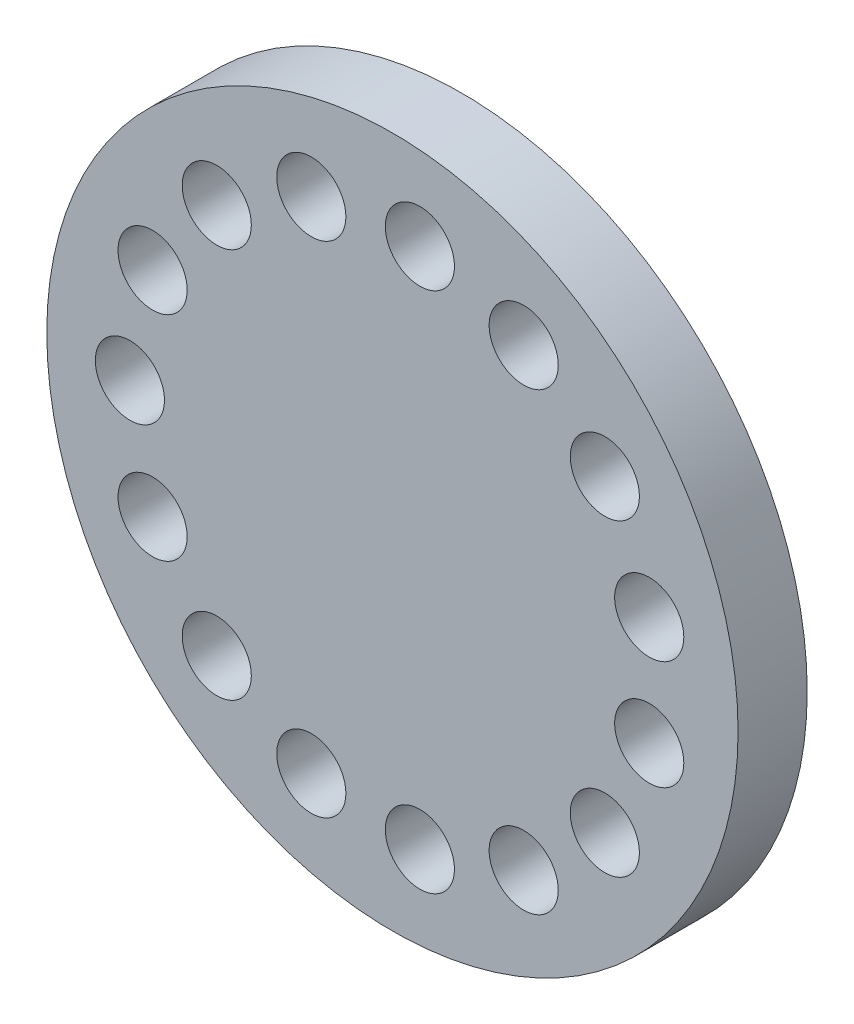
ISO-10303-21;
HEADER;
FILE_DESCRIPTION(('STEP AP214'),'2;1');
FILE_NAME('part.step','',(''),(''),'','','');
FILE_SCHEMA(('AUTOMOTIVE_DESIGN { 1 0 10303 214 1 1 1 1 }'));
ENDSEC;
DATA;
#1=APPLICATION_CONTEXT('core data for automotive mechanical design processes');
#2=APPLICATION_PROTOCOL_DEFINITION('international standard','automotive_design',2000,#1);
#3=PRODUCT_CONTEXT('',#1,'mechanical');
#4=PRODUCT('Part','Part','',(#3));
#5=PRODUCT_RELATED_PRODUCT_CATEGORY('part','',(#4));
#6=PRODUCT_DEFINITION_FORMATION('','',#4);
#7=PRODUCT_DEFINITION_CONTEXT('part definition',#1,'design');
#8=PRODUCT_DEFINITION('design','',#6,#7);
#9=PRODUCT_DEFINITION_SHAPE('','',#8);
#10=(LENGTH_UNIT() NAMED_UNIT(*) SI_UNIT(.MILLI.,.METRE.));
#11=(NAMED_UNIT(*) PLANE_ANGLE_UNIT() SI_UNIT($,.RADIAN.));
#12=(NAMED_UNIT(*) SI_UNIT($,.STERADIAN.) SOLID_ANGLE_UNIT());
#13=UNCERTAINTY_MEASURE_WITH_UNIT(LENGTH_MEASURE(1.E-05),#10,'distance_accuracy_value','');
#14=(GEOMETRIC_REPRESENTATION_CONTEXT(3) GLOBAL_UNCERTAINTY_ASSIGNED_CONTEXT((#13)) GLOBAL_UNIT_ASSIGNED_CONTEXT((#10,
#11,#12)) REPRESENTATION_CONTEXT('',''));
#15=CARTESIAN_POINT('',(0.,0.,0.));
#16=DIRECTION('',(0.,0.,1.));
#17=DIRECTION('',(1.,0.,0.));
#18=AXIS2_PLACEMENT_3D('',#15,#16,#17);
#19=CARTESIAN_POINT('',(0.,0.,10.));
#20=DIRECTION('',(0.,0.,1.));
#21=DIRECTION('',(1.,0.,0.));
#22=AXIS2_PLACEMENT_3D('',#19,#20,#21);
#23=PLANE('',#22);
#24=CARTESIAN_POINT('',(-25.4116394399646,-28.2224847843511,10.));
#25=DIRECTION('',(0.,0.,1.));
#26=DIRECTION('',(1.,0.,0.));
#27=AXIS2_PLACEMENT_3D('',#24,#25,#26);
#28=CIRCLE('',#27,5.);
#29=CARTESIAN_POINT('',(-20.4116394399646,-28.2224847843511,10.));
#30=VERTEX_POINT('',#29);
#31=EDGE_CURVE('E118',#30,#30,#28,.T.);
#32=ORIENTED_EDGE('',*,*,#31,.F.);
#33=EDGE_LOOP('',(#32));
#34=FACE_BOUND('',#33,.T.);
#35=CARTESIAN_POINT('',(3.9696878225689,-37.7690567134135,10.));
#36=DIRECTION('',(0.,0.,1.));
#37=DIRECTION('',(1.,0.,0.));
#38=AXIS2_PLACEMENT_3D('',#35,#36,#37);
#39=CIRCLE('',#38,5.);
#40=CARTESIAN_POINT('',(8.96968782256891,-37.7690567134135,10.));
#41=VERTEX_POINT('',#40);
#42=EDGE_CURVE('E106',#41,#41,#39,.T.);
#43=ORIENTED_EDGE('',*,*,#42,.F.);
#44=EDGE_LOOP('',(#43));
#45=FACE_BOUND('',#44,.T.);
#46=CARTESIAN_POINT('',(30.7241186795064,-22.3223788561457,10.));
#47=DIRECTION('',(0.,0.,1.));
#48=DIRECTION('',(1.,0.,0.));
#49=AXIS2_PLACEMENT_3D('',#46,#47,#48);
#50=CIRCLE('',#49,5.);
#51=CARTESIAN_POINT('',(35.7241186795064,-22.3223788561457,10.));
#52=VERTEX_POINT('',#51);
#53=EDGE_CURVE('E94',#52,#52,#50,.T.);
#54=ORIENTED_EDGE('',*,*,#53,.F.);
#55=EDGE_LOOP('',(#54));
#56=FACE_BOUND('',#55,.T.);
#57=CARTESIAN_POINT('',(37.1472085011503,7.89588291464368,10.));
#58=DIRECTION('',(0.,0.,1.));
#59=DIRECTION('',(1.,0.,0.));
#60=AXIS2_PLACEMENT_3D('',#57,#58,#59);
#61=CIRCLE('',#60,5.);
#62=CARTESIAN_POINT('',(42.1472085011503,7.89588291464368,10.));
#63=VERTEX_POINT('',#62);
#64=EDGE_CURVE('E82',#63,#63,#61,.T.);
#65=ORIENTED_EDGE('',*,*,#64,.F.);
#66=EDGE_LOOP('',(#65));
#67=FACE_BOUND('',#66,.T.);
#68=CARTESIAN_POINT('',(18.9885496183208,32.8891327009738,10.));
#69=DIRECTION('',(0.,0.,1.));
#70=DIRECTION('',(1.,0.,0.));
#71=AXIS2_PLACEMENT_3D('',#68,#69,#70);
#72=CIRCLE('',#71,5.);
#73=CARTESIAN_POINT('',(23.9885496183208,32.8891327009738,10.));
#74=VERTEX_POINT('',#73);
#75=EDGE_CURVE('E70',#74,#74,#72,.T.);
#76=ORIENTED_EDGE('',*,*,#75,.F.);
#77=EDGE_LOOP('',(#76));
#78=FACE_BOUND('',#77,.T.);
#79=CARTESIAN_POINT('',(-11.7355690611859,36.1183676989954,10.));
#80=DIRECTION('',(0.,0.,1.));
#81=DIRECTION('',(1.,0.,0.));
#82=AXIS2_PLACEMENT_3D('',#79,#80,#81);
#83=CIRCLE('',#82,4.99999999999999);
#84=CARTESIAN_POINT('',(-6.7355690611859,36.1183676989954,10.));
#85=VERTEX_POINT('',#84);
#86=EDGE_CURVE('E58',#85,#85,#83,.T.);
#87=ORIENTED_EDGE('',*,*,#86,.F.);
#88=EDGE_LOOP('',(#87));
#89=FACE_BOUND('',#88,.T.);
#90=CARTESIAN_POINT('',(-34.6938065020759,15.446677857268,10.));
#91=DIRECTION('',(0.,0.,1.));
#92=DIRECTION('',(1.,0.,0.));
#93=AXIS2_PLACEMENT_3D('',#90,#91,#92);
#94=CIRCLE('',#93,5.);
#95=CARTESIAN_POINT('',(-29.6938065020759,15.446677857268,10.));
#96=VERTEX_POINT('',#95);
#97=EDGE_CURVE('E46',#96,#96,#94,.T.);
#98=ORIENTED_EDGE('',*,*,#97,.F.);
#99=EDGE_LOOP('',(#98));
#100=FACE_BOUND('',#99,.T.);
#101=CARTESIAN_POINT('',(0.,0.,10.));
#102=DIRECTION('',(0.,0.,1.));
#103=DIRECTION('',(1.,0.,0.));
#104=AXIS2_PLACEMENT_3D('',#101,#102,#103);
#105=CIRCLE('',#104,50.);
#106=CARTESIAN_POINT('',(50.,0.,10.));
#107=VERTEX_POINT('',#106);
#108=EDGE_CURVE('E10',#107,#107,#105,.T.);
#109=ORIENTED_EDGE('',*,*,#108,.T.);
#110=EDGE_LOOP('',(#109));
#111=FACE_BOUND('',#110,.T.);
#112=CARTESIAN_POINT('',(-37.9770992366412,0.,10.));
#113=DIRECTION('',(0.,0.,1.));
#114=DIRECTION('',(1.,0.,0.));
#115=AXIS2_PLACEMENT_3D('',#112,#113,#114);
#116=CIRCLE('',#115,5.);
#117=CARTESIAN_POINT('',(-32.9770992366412,0.,10.));
#118=VERTEX_POINT('',#117);
#119=EDGE_CURVE('E41',#118,#118,#116,.T.);
#120=ORIENTED_EDGE('',*,*,#119,.F.);
#121=EDGE_LOOP('',(#120));
#122=FACE_BOUND('',#121,.T.);
#123=CARTESIAN_POINT('',(-25.4116394399642,28.2224847843515,10.));
#124=DIRECTION('',(0.,0.,1.));
#125=DIRECTION('',(1.,0.,0.));
#126=AXIS2_PLACEMENT_3D('',#123,#124,#125);
#127=CIRCLE('',#126,5.);
#128=CARTESIAN_POINT('',(-20.4116394399642,28.2224847843515,10.));
#129=VERTEX_POINT('',#128);
#130=EDGE_CURVE('E52',#129,#129,#127,.T.);
#131=ORIENTED_EDGE('',*,*,#130,.F.);
#132=EDGE_LOOP('',(#131));
#133=FACE_BOUND('',#132,.T.);
#134=CARTESIAN_POINT('',(3.96968782256942,37.7690567134134,10.));
#135=DIRECTION('',(0.,0.,1.));
#136=DIRECTION('',(1.,0.,0.));
#137=AXIS2_PLACEMENT_3D('',#134,#135,#136);
#138=CIRCLE('',#137,5.);
#139=CARTESIAN_POINT('',(8.96968782256942,37.7690567134134,10.));
#140=VERTEX_POINT('',#139);
#141=EDGE_CURVE('E64',#140,#140,#138,.T.);
#142=ORIENTED_EDGE('',*,*,#141,.F.);
#143=EDGE_LOOP('',(#142));
#144=FACE_BOUND('',#143,.T.);
#145=CARTESIAN_POINT('',(30.7241186795067,22.3223788561453,10.));
#146=DIRECTION('',(0.,0.,1.));
#147=DIRECTION('',(1.,0.,0.));
#148=AXIS2_PLACEMENT_3D('',#145,#146,#147);
#149=CIRCLE('',#148,5.);
#150=CARTESIAN_POINT('',(35.7241186795067,22.3223788561453,10.));
#151=VERTEX_POINT('',#150);
#152=EDGE_CURVE('E76',#151,#151,#149,.T.);
#153=ORIENTED_EDGE('',*,*,#152,.F.);
#154=EDGE_LOOP('',(#153));
#155=FACE_BOUND('',#154,.T.);
#156=CARTESIAN_POINT('',(37.1472085011502,-7.89588291464418,10.));
#157=DIRECTION('',(0.,0.,1.));
#158=DIRECTION('',(1.,0.,0.));
#159=AXIS2_PLACEMENT_3D('',#156,#157,#158);
#160=CIRCLE('',#159,4.99999999999999);
#161=CARTESIAN_POINT('',(42.1472085011502,-7.89588291464418,10.));
#162=VERTEX_POINT('',#161);
#163=EDGE_CURVE('E88',#162,#162,#160,.T.);
#164=ORIENTED_EDGE('',*,*,#163,.F.);
#165=EDGE_LOOP('',(#164));
#166=FACE_BOUND('',#165,.T.);
#167=CARTESIAN_POINT('',(18.9885496183203,-32.8891327009741,10.));
#168=DIRECTION('',(0.,0.,1.));
#169=DIRECTION('',(1.,0.,0.));
#170=AXIS2_PLACEMENT_3D('',#167,#168,#169);
#171=CIRCLE('',#170,5.);
#172=CARTESIAN_POINT('',(23.9885496183203,-32.8891327009741,10.));
#173=VERTEX_POINT('',#172);
#174=EDGE_CURVE('E100',#173,#173,#171,.T.);
#175=ORIENTED_EDGE('',*,*,#174,.F.);
#176=EDGE_LOOP('',(#175));
#177=FACE_BOUND('',#176,.T.);
#178=CARTESIAN_POINT('',(-11.7355690611864,-36.1183676989952,10.));
#179=DIRECTION('',(0.,0.,1.));
#180=DIRECTION('',(1.,0.,0.));
#181=AXIS2_PLACEMENT_3D('',#178,#179,#180);
#182=CIRCLE('',#181,5.);
#183=CARTESIAN_POINT('',(-6.73556906118636,-36.1183676989952,10.));
#184=VERTEX_POINT('',#183);
#185=EDGE_CURVE('E112',#184,#184,#182,.T.);
#186=ORIENTED_EDGE('',*,*,#185,.F.);
#187=EDGE_LOOP('',(#186));
#188=FACE_BOUND('',#187,.T.);
#189=CARTESIAN_POINT('',(-34.6938065020761,-15.4466778572676,10.));
#190=DIRECTION('',(0.,0.,1.));
#191=DIRECTION('',(1.,0.,0.));
#192=AXIS2_PLACEMENT_3D('',#189,#190,#191);
#193=CIRCLE('',#192,5.);
#194=CARTESIAN_POINT('',(-29.6938065020761,-15.4466778572676,10.));
#195=VERTEX_POINT('',#194);
#196=EDGE_CURVE('E124',#195,#195,#193,.T.);
#197=ORIENTED_EDGE('',*,*,#196,.F.);
#198=EDGE_LOOP('',(#197));
#199=FACE_BOUND('',#198,.T.);
#200=ADVANCED_FACE('F30',(#34,#45,#56,#67,#78,#89,#100,#111,#122,#133,#144,#155,#166,#177,#188,
#199),#23,.T.);
#201=CARTESIAN_POINT('',(0.,0.,0.));
#202=DIRECTION('',(0.,0.,1.));
#203=DIRECTION('',(1.,0.,0.));
#204=AXIS2_PLACEMENT_3D('',#201,#202,#203);
#205=PLANE('',#204);
#206=CARTESIAN_POINT('',(0.,0.,0.));
#207=DIRECTION('',(0.,0.,1.));
#208=DIRECTION('',(1.,0.,0.));
#209=AXIS2_PLACEMENT_3D('',#206,#207,#208);
#210=CIRCLE('',#209,50.);
#211=CARTESIAN_POINT('',(50.,0.,0.));
#212=VERTEX_POINT('',#211);
#213=EDGE_CURVE('E34',#212,#212,#210,.T.);
#214=ORIENTED_EDGE('',*,*,#213,.F.);
#215=EDGE_LOOP('',(#214));
#216=FACE_BOUND('',#215,.T.);
#217=CARTESIAN_POINT('',(-37.9770992366412,0.,0.));
#218=DIRECTION('',(0.,0.,1.));
#219=DIRECTION('',(1.,0.,0.));
#220=AXIS2_PLACEMENT_3D('',#217,#218,#219);
#221=CIRCLE('',#220,5.);
#222=CARTESIAN_POINT('',(-32.9770992366412,0.,0.));
#223=VERTEX_POINT('',#222);
#224=EDGE_CURVE('E43',#223,#223,#221,.T.);
#225=ORIENTED_EDGE('',*,*,#224,.T.);
#226=EDGE_LOOP('',(#225));
#227=FACE_BOUND('',#226,.T.);
#228=CARTESIAN_POINT('',(-34.6938065020759,15.446677857268,0.));
#229=DIRECTION('',(0.,0.,1.));
#230=DIRECTION('',(1.,0.,0.));
#231=AXIS2_PLACEMENT_3D('',#228,#229,#230);
#232=CIRCLE('',#231,5.);
#233=CARTESIAN_POINT('',(-29.6938065020759,15.446677857268,0.));
#234=VERTEX_POINT('',#233);
#235=EDGE_CURVE('E49',#234,#234,#232,.T.);
#236=ORIENTED_EDGE('',*,*,#235,.T.);
#237=EDGE_LOOP('',(#236));
#238=FACE_BOUND('',#237,.T.);
#239=CARTESIAN_POINT('',(-25.4116394399642,28.2224847843515,0.));
#240=DIRECTION('',(0.,0.,1.));
#241=DIRECTION('',(1.,0.,0.));
#242=AXIS2_PLACEMENT_3D('',#239,#240,#241);
#243=CIRCLE('',#242,5.);
#244=CARTESIAN_POINT('',(-20.4116394399642,28.2224847843515,0.));
#245=VERTEX_POINT('',#244);
#246=EDGE_CURVE('E55',#245,#245,#243,.T.);
#247=ORIENTED_EDGE('',*,*,#246,.T.);
#248=EDGE_LOOP('',(#247));
#249=FACE_BOUND('',#248,.T.);
#250=CARTESIAN_POINT('',(-11.7355690611859,36.1183676989954,0.));
#251=DIRECTION('',(0.,0.,1.));
#252=DIRECTION('',(1.,0.,0.));
#253=AXIS2_PLACEMENT_3D('',#250,#251,#252);
#254=CIRCLE('',#253,4.99999999999999);
#255=CARTESIAN_POINT('',(-6.7355690611859,36.1183676989954,0.));
#256=VERTEX_POINT('',#255);
#257=EDGE_CURVE('E61',#256,#256,#254,.T.);
#258=ORIENTED_EDGE('',*,*,#257,.T.);
#259=EDGE_LOOP('',(#258));
#260=FACE_BOUND('',#259,.T.);
#261=CARTESIAN_POINT('',(3.96968782256942,37.7690567134134,0.));
#262=DIRECTION('',(0.,0.,1.));
#263=DIRECTION('',(1.,0.,0.));
#264=AXIS2_PLACEMENT_3D('',#261,#262,#263);
#265=CIRCLE('',#264,5.);
#266=CARTESIAN_POINT('',(8.96968782256942,37.7690567134134,0.));
#267=VERTEX_POINT('',#266);
#268=EDGE_CURVE('E67',#267,#267,#265,.T.);
#269=ORIENTED_EDGE('',*,*,#268,.T.);
#270=EDGE_LOOP('',(#269));
#271=FACE_BOUND('',#270,.T.);
#272=CARTESIAN_POINT('',(18.9885496183208,32.8891327009738,0.));
#273=DIRECTION('',(0.,0.,1.));
#274=DIRECTION('',(1.,0.,0.));
#275=AXIS2_PLACEMENT_3D('',#272,#273,#274);
#276=CIRCLE('',#275,5.);
#277=CARTESIAN_POINT('',(23.9885496183208,32.8891327009738,0.));
#278=VERTEX_POINT('',#277);
#279=EDGE_CURVE('E73',#278,#278,#276,.T.);
#280=ORIENTED_EDGE('',*,*,#279,.T.);
#281=EDGE_LOOP('',(#280));
#282=FACE_BOUND('',#281,.T.);
#283=CARTESIAN_POINT('',(30.7241186795067,22.3223788561453,0.));
#284=DIRECTION('',(0.,0.,1.));
#285=DIRECTION('',(1.,0.,0.));
#286=AXIS2_PLACEMENT_3D('',#283,#284,#285);
#287=CIRCLE('',#286,5.);
#288=CARTESIAN_POINT('',(35.7241186795067,22.3223788561453,0.));
#289=VERTEX_POINT('',#288);
#290=EDGE_CURVE('E79',#289,#289,#287,.T.);
#291=ORIENTED_EDGE('',*,*,#290,.T.);
#292=EDGE_LOOP('',(#291));
#293=FACE_BOUND('',#292,.T.);
#294=CARTESIAN_POINT('',(37.1472085011503,7.89588291464368,0.));
#295=DIRECTION('',(0.,0.,1.));
#296=DIRECTION('',(1.,0.,0.));
#297=AXIS2_PLACEMENT_3D('',#294,#295,#296);
#298=CIRCLE('',#297,5.);
#299=CARTESIAN_POINT('',(42.1472085011503,7.89588291464368,0.));
#300=VERTEX_POINT('',#299);
#301=EDGE_CURVE('E85',#300,#300,#298,.T.);
#302=ORIENTED_EDGE('',*,*,#301,.T.);
#303=EDGE_LOOP('',(#302));
#304=FACE_BOUND('',#303,.T.);
#305=CARTESIAN_POINT('',(37.1472085011502,-7.89588291464418,0.));
#306=DIRECTION('',(0.,0.,1.));
#307=DIRECTION('',(1.,0.,0.));
#308=AXIS2_PLACEMENT_3D('',#305,#306,#307);
#309=CIRCLE('',#308,4.99999999999999);
#310=CARTESIAN_POINT('',(42.1472085011502,-7.89588291464418,0.));
#311=VERTEX_POINT('',#310);
#312=EDGE_CURVE('E91',#311,#311,#309,.T.);
#313=ORIENTED_EDGE('',*,*,#312,.T.);
#314=EDGE_LOOP('',(#313));
#315=FACE_BOUND('',#314,.T.);
#316=CARTESIAN_POINT('',(30.7241186795064,-22.3223788561457,0.));
#317=DIRECTION('',(0.,0.,1.));
#318=DIRECTION('',(1.,0.,0.));
#319=AXIS2_PLACEMENT_3D('',#316,#317,#318);
#320=CIRCLE('',#319,5.);
#321=CARTESIAN_POINT('',(35.7241186795064,-22.3223788561457,0.));
#322=VERTEX_POINT('',#321);
#323=EDGE_CURVE('E97',#322,#322,#320,.T.);
#324=ORIENTED_EDGE('',*,*,#323,.T.);
#325=EDGE_LOOP('',(#324));
#326=FACE_BOUND('',#325,.T.);
#327=CARTESIAN_POINT('',(18.9885496183203,-32.8891327009741,0.));
#328=DIRECTION('',(0.,0.,1.));
#329=DIRECTION('',(1.,0.,0.));
#330=AXIS2_PLACEMENT_3D('',#327,#328,#329);
#331=CIRCLE('',#330,5.);
#332=CARTESIAN_POINT('',(23.9885496183203,-32.8891327009741,0.));
#333=VERTEX_POINT('',#332);
#334=EDGE_CURVE('E103',#333,#333,#331,.T.);
#335=ORIENTED_EDGE('',*,*,#334,.T.);
#336=EDGE_LOOP('',(#335));
#337=FACE_BOUND('',#336,.T.);
#338=CARTESIAN_POINT('',(3.9696878225689,-37.7690567134135,0.));
#339=DIRECTION('',(0.,0.,1.));
#340=DIRECTION('',(1.,0.,0.));
#341=AXIS2_PLACEMENT_3D('',#338,#339,#340);
#342=CIRCLE('',#341,5.);
#343=CARTESIAN_POINT('',(8.96968782256891,-37.7690567134135,0.));
#344=VERTEX_POINT('',#343);
#345=EDGE_CURVE('E109',#344,#344,#342,.T.);
#346=ORIENTED_EDGE('',*,*,#345,.T.);
#347=EDGE_LOOP('',(#346));
#348=FACE_BOUND('',#347,.T.);
#349=CARTESIAN_POINT('',(-11.7355690611864,-36.1183676989952,0.));
#350=DIRECTION('',(0.,0.,1.));
#351=DIRECTION('',(1.,0.,0.));
#352=AXIS2_PLACEMENT_3D('',#349,#350,#351);
#353=CIRCLE('',#352,5.);
#354=CARTESIAN_POINT('',(-6.73556906118636,-36.1183676989952,0.));
#355=VERTEX_POINT('',#354);
#356=EDGE_CURVE('E115',#355,#355,#353,.T.);
#357=ORIENTED_EDGE('',*,*,#356,.T.);
#358=EDGE_LOOP('',(#357));
#359=FACE_BOUND('',#358,.T.);
#360=CARTESIAN_POINT('',(-25.4116394399646,-28.2224847843511,0.));
#361=DIRECTION('',(0.,0.,1.));
#362=DIRECTION('',(1.,0.,0.));
#363=AXIS2_PLACEMENT_3D('',#360,#361,#362);
#364=CIRCLE('',#363,5.);
#365=CARTESIAN_POINT('',(-20.4116394399646,-28.2224847843511,0.));
#366=VERTEX_POINT('',#365);
#367=EDGE_CURVE('E121',#366,#366,#364,.T.);
#368=ORIENTED_EDGE('',*,*,#367,.T.);
#369=EDGE_LOOP('',(#368));
#370=FACE_BOUND('',#369,.T.);
#371=CARTESIAN_POINT('',(-34.6938065020761,-15.4466778572676,0.));
#372=DIRECTION('',(0.,0.,1.));
#373=DIRECTION('',(1.,0.,0.));
#374=AXIS2_PLACEMENT_3D('',#371,#372,#373);
#375=CIRCLE('',#374,5.);
#376=CARTESIAN_POINT('',(-29.6938065020761,-15.4466778572676,0.));
#377=VERTEX_POINT('',#376);
#378=EDGE_CURVE('E127',#377,#377,#375,.T.);
#379=ORIENTED_EDGE('',*,*,#378,.T.);
#380=EDGE_LOOP('',(#379));
#381=FACE_BOUND('',#380,.T.);
#382=ADVANCED_FACE('F137',(#216,#227,#238,#249,#260,#271,#282,#293,#304,#315,#326,#337,#348,
#359,#370,#381),#205,.F.);
#383=CARTESIAN_POINT('',(0.,0.,10.));
#384=DIRECTION('',(0.,0.,-1.));
#385=DIRECTION('',(-1.,0.,0.));
#386=AXIS2_PLACEMENT_3D('',#383,#384,#385);
#387=CYLINDRICAL_SURFACE('',#386,50.);
#388=ORIENTED_EDGE('',*,*,#108,.F.);
#389=EDGE_LOOP('',(#388));
#390=FACE_BOUND('',#389,.T.);
#391=ORIENTED_EDGE('',*,*,#213,.T.);
#392=EDGE_LOOP('',(#391));
#393=FACE_BOUND('',#392,.T.);
#394=ADVANCED_FACE('F32',(#390,#393),#387,.T.);
#395=CARTESIAN_POINT('',(-37.9770992366412,0.,10.));
#396=DIRECTION('',(0.,0.,-1.));
#397=DIRECTION('',(-1.,0.,0.));
#398=AXIS2_PLACEMENT_3D('',#395,#396,#397);
#399=CYLINDRICAL_SURFACE('',#398,5.);
#400=ORIENTED_EDGE('',*,*,#119,.T.);
#401=EDGE_LOOP('',(#400));
#402=FACE_BOUND('',#401,.T.);
#403=ORIENTED_EDGE('',*,*,#224,.F.);
#404=EDGE_LOOP('',(#403));
#405=FACE_BOUND('',#404,.T.);
#406=ADVANCED_FACE('F147',(#402,#405),#399,.F.);
#407=CARTESIAN_POINT('',(-34.6938065020759,15.446677857268,10.));
#408=DIRECTION('',(0.,0.,-1.));
#409=DIRECTION('',(-1.,0.,0.));
#410=AXIS2_PLACEMENT_3D('',#407,#408,#409);
#411=CYLINDRICAL_SURFACE('',#410,5.);
#412=ORIENTED_EDGE('',*,*,#97,.T.);
#413=EDGE_LOOP('',(#412));
#414=FACE_BOUND('',#413,.T.);
#415=ORIENTED_EDGE('',*,*,#235,.F.);
#416=EDGE_LOOP('',(#415));
#417=FACE_BOUND('',#416,.T.);
#418=ADVANCED_FACE('F150',(#414,#417),#411,.F.);
#419=CARTESIAN_POINT('',(-25.4116394399642,28.2224847843515,10.));
#420=DIRECTION('',(0.,0.,-1.));
#421=DIRECTION('',(-1.,0.,0.));
#422=AXIS2_PLACEMENT_3D('',#419,#420,#421);
#423=CYLINDRICAL_SURFACE('',#422,5.);
#424=ORIENTED_EDGE('',*,*,#130,.T.);
#425=EDGE_LOOP('',(#424));
#426=FACE_BOUND('',#425,.T.);
#427=ORIENTED_EDGE('',*,*,#246,.F.);
#428=EDGE_LOOP('',(#427));
#429=FACE_BOUND('',#428,.T.);
#430=ADVANCED_FACE('F154',(#426,#429),#423,.F.);
#431=CARTESIAN_POINT('',(-11.7355690611859,36.1183676989954,10.));
#432=DIRECTION('',(0.,0.,-1.));
#433=DIRECTION('',(-1.,0.,0.));
#434=AXIS2_PLACEMENT_3D('',#431,#432,#433);
#435=CYLINDRICAL_SURFACE('',#434,4.99999999999999);
#436=ORIENTED_EDGE('',*,*,#86,.T.);
#437=EDGE_LOOP('',(#436));
#438=FACE_BOUND('',#437,.T.);
#439=ORIENTED_EDGE('',*,*,#257,.F.);
#440=EDGE_LOOP('',(#439));
#441=FACE_BOUND('',#440,.T.);
#442=ADVANCED_FACE('F158',(#438,#441),#435,.F.);
#443=CARTESIAN_POINT('',(3.96968782256942,37.7690567134134,10.));
#444=DIRECTION('',(0.,0.,-1.));
#445=DIRECTION('',(-1.,0.,0.));
#446=AXIS2_PLACEMENT_3D('',#443,#444,#445);
#447=CYLINDRICAL_SURFACE('',#446,5.);
#448=ORIENTED_EDGE('',*,*,#141,.T.);
#449=EDGE_LOOP('',(#448));
#450=FACE_BOUND('',#449,.T.);
#451=ORIENTED_EDGE('',*,*,#268,.F.);
#452=EDGE_LOOP('',(#451));
#453=FACE_BOUND('',#452,.T.);
#454=ADVANCED_FACE('F162',(#450,#453),#447,.F.);
#455=CARTESIAN_POINT('',(18.9885496183208,32.8891327009738,10.));
#456=DIRECTION('',(0.,0.,-1.));
#457=DIRECTION('',(-1.,0.,0.));
#458=AXIS2_PLACEMENT_3D('',#455,#456,#457);
#459=CYLINDRICAL_SURFACE('',#458,5.);
#460=ORIENTED_EDGE('',*,*,#75,.T.);
#461=EDGE_LOOP('',(#460));
#462=FACE_BOUND('',#461,.T.);
#463=ORIENTED_EDGE('',*,*,#279,.F.);
#464=EDGE_LOOP('',(#463));
#465=FACE_BOUND('',#464,.T.);
#466=ADVANCED_FACE('F166',(#462,#465),#459,.F.);
#467=CARTESIAN_POINT('',(30.7241186795067,22.3223788561453,10.));
#468=DIRECTION('',(0.,0.,-1.));
#469=DIRECTION('',(-1.,0.,0.));
#470=AXIS2_PLACEMENT_3D('',#467,#468,#469);
#471=CYLINDRICAL_SURFACE('',#470,5.);
#472=ORIENTED_EDGE('',*,*,#152,.T.);
#473=EDGE_LOOP('',(#472));
#474=FACE_BOUND('',#473,.T.);
#475=ORIENTED_EDGE('',*,*,#290,.F.);
#476=EDGE_LOOP('',(#475));
#477=FACE_BOUND('',#476,.T.);
#478=ADVANCED_FACE('F170',(#474,#477),#471,.F.);
#479=CARTESIAN_POINT('',(37.1472085011503,7.89588291464368,10.));
#480=DIRECTION('',(0.,0.,-1.));
#481=DIRECTION('',(-1.,0.,0.));
#482=AXIS2_PLACEMENT_3D('',#479,#480,#481);
#483=CYLINDRICAL_SURFACE('',#482,5.);
#484=ORIENTED_EDGE('',*,*,#64,.T.);
#485=EDGE_LOOP('',(#484));
#486=FACE_BOUND('',#485,.T.);
#487=ORIENTED_EDGE('',*,*,#301,.F.);
#488=EDGE_LOOP('',(#487));
#489=FACE_BOUND('',#488,.T.);
#490=ADVANCED_FACE('F174',(#486,#489),#483,.F.);
#491=CARTESIAN_POINT('',(37.1472085011502,-7.89588291464418,10.));
#492=DIRECTION('',(0.,0.,-1.));
#493=DIRECTION('',(-1.,0.,0.));
#494=AXIS2_PLACEMENT_3D('',#491,#492,#493);
#495=CYLINDRICAL_SURFACE('',#494,4.99999999999999);
#496=ORIENTED_EDGE('',*,*,#163,.T.);
#497=EDGE_LOOP('',(#496));
#498=FACE_BOUND('',#497,.T.);
#499=ORIENTED_EDGE('',*,*,#312,.F.);
#500=EDGE_LOOP('',(#499));
#501=FACE_BOUND('',#500,.T.);
#502=ADVANCED_FACE('F178',(#498,#501),#495,.F.);
#503=CARTESIAN_POINT('',(30.7241186795064,-22.3223788561457,10.));
#504=DIRECTION('',(0.,0.,-1.));
#505=DIRECTION('',(-1.,0.,0.));
#506=AXIS2_PLACEMENT_3D('',#503,#504,#505);
#507=CYLINDRICAL_SURFACE('',#506,5.);
#508=ORIENTED_EDGE('',*,*,#53,.T.);
#509=EDGE_LOOP('',(#508));
#510=FACE_BOUND('',#509,.T.);
#511=ORIENTED_EDGE('',*,*,#323,.F.);
#512=EDGE_LOOP('',(#511));
#513=FACE_BOUND('',#512,.T.);
#514=ADVANCED_FACE('F182',(#510,#513),#507,.F.);
#515=CARTESIAN_POINT('',(18.9885496183203,-32.8891327009741,10.));
#516=DIRECTION('',(0.,0.,-1.));
#517=DIRECTION('',(-1.,0.,0.));
#518=AXIS2_PLACEMENT_3D('',#515,#516,#517);
#519=CYLINDRICAL_SURFACE('',#518,5.);
#520=ORIENTED_EDGE('',*,*,#174,.T.);
#521=EDGE_LOOP('',(#520));
#522=FACE_BOUND('',#521,.T.);
#523=ORIENTED_EDGE('',*,*,#334,.F.);
#524=EDGE_LOOP('',(#523));
#525=FACE_BOUND('',#524,.T.);
#526=ADVANCED_FACE('F186',(#522,#525),#519,.F.);
#527=CARTESIAN_POINT('',(3.9696878225689,-37.7690567134135,10.));
#528=DIRECTION('',(0.,0.,-1.));
#529=DIRECTION('',(-1.,0.,0.));
#530=AXIS2_PLACEMENT_3D('',#527,#528,#529);
#531=CYLINDRICAL_SURFACE('',#530,5.);
#532=ORIENTED_EDGE('',*,*,#42,.T.);
#533=EDGE_LOOP('',(#532));
#534=FACE_BOUND('',#533,.T.);
#535=ORIENTED_EDGE('',*,*,#345,.F.);
#536=EDGE_LOOP('',(#535));
#537=FACE_BOUND('',#536,.T.);
#538=ADVANCED_FACE('F190',(#534,#537),#531,.F.);
#539=CARTESIAN_POINT('',(-11.7355690611864,-36.1183676989952,10.));
#540=DIRECTION('',(0.,0.,-1.));
#541=DIRECTION('',(-1.,0.,0.));
#542=AXIS2_PLACEMENT_3D('',#539,#540,#541);
#543=CYLINDRICAL_SURFACE('',#542,5.);
#544=ORIENTED_EDGE('',*,*,#185,.T.);
#545=EDGE_LOOP('',(#544));
#546=FACE_BOUND('',#545,.T.);
#547=ORIENTED_EDGE('',*,*,#356,.F.);
#548=EDGE_LOOP('',(#547));
#549=FACE_BOUND('',#548,.T.);
#550=ADVANCED_FACE('F194',(#546,#549),#543,.F.);
#551=CARTESIAN_POINT('',(-25.4116394399646,-28.2224847843511,10.));
#552=DIRECTION('',(0.,0.,-1.));
#553=DIRECTION('',(-1.,0.,0.));
#554=AXIS2_PLACEMENT_3D('',#551,#552,#553);
#555=CYLINDRICAL_SURFACE('',#554,5.);
#556=ORIENTED_EDGE('',*,*,#31,.T.);
#557=EDGE_LOOP('',(#556));
#558=FACE_BOUND('',#557,.T.);
#559=ORIENTED_EDGE('',*,*,#367,.F.);
#560=EDGE_LOOP('',(#559));
#561=FACE_BOUND('',#560,.T.);
#562=ADVANCED_FACE('F198',(#558,#561),#555,.F.);
#563=CARTESIAN_POINT('',(-34.6938065020761,-15.4466778572676,10.));
#564=DIRECTION('',(0.,0.,-1.));
#565=DIRECTION('',(-1.,0.,0.));
#566=AXIS2_PLACEMENT_3D('',#563,#564,#565);
#567=CYLINDRICAL_SURFACE('',#566,5.);
#568=ORIENTED_EDGE('',*,*,#196,.T.);
#569=EDGE_LOOP('',(#568));
#570=FACE_BOUND('',#569,.T.);
#571=ORIENTED_EDGE('',*,*,#378,.F.);
#572=EDGE_LOOP('',(#571));
#573=FACE_BOUND('',#572,.T.);
#574=ADVANCED_FACE('F133',(#570,#573),#567,.F.);
#575=CLOSED_SHELL('',(#200,#382,#394,#406,#418,#430,#442,#454,#466,#478,#490,#502,#514,#526,
#538,#550,#562,#574));
#576=MANIFOLD_SOLID_BREP('B2',#575);
#577=ADVANCED_BREP_SHAPE_REPRESENTATION('',(#18,#576),#14);
#578=SHAPE_DEFINITION_REPRESENTATION(#9,#577);
ENDSEC;
END-ISO-10303-21;
